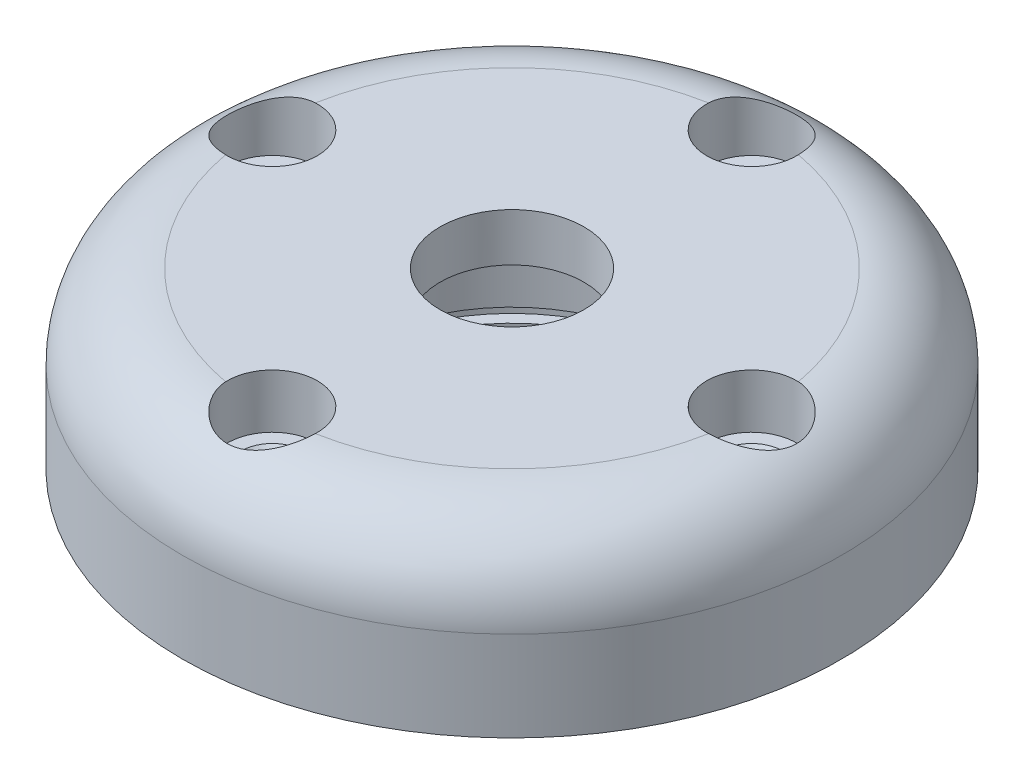
ISO-10303-21;
HEADER;
FILE_DESCRIPTION(('STEP AP214'),'2;1');
FILE_NAME('part.step','',(''),(''),'','','');
FILE_SCHEMA(('AUTOMOTIVE_DESIGN { 1 0 10303 214 1 1 1 1 }'));
ENDSEC;
DATA;
#1=APPLICATION_CONTEXT('core data for automotive mechanical design processes');
#2=APPLICATION_PROTOCOL_DEFINITION('international standard','automotive_design',2000,#1);
#3=PRODUCT_CONTEXT('',#1,'mechanical');
#4=PRODUCT('Part','Part','',(#3));
#5=PRODUCT_RELATED_PRODUCT_CATEGORY('part','',(#4));
#6=PRODUCT_DEFINITION_FORMATION('','',#4);
#7=PRODUCT_DEFINITION_CONTEXT('part definition',#1,'design');
#8=PRODUCT_DEFINITION('design','',#6,#7);
#9=PRODUCT_DEFINITION_SHAPE('','',#8);
#10=(LENGTH_UNIT() NAMED_UNIT(*) SI_UNIT(.MILLI.,.METRE.));
#11=(NAMED_UNIT(*) PLANE_ANGLE_UNIT() SI_UNIT($,.RADIAN.));
#12=(NAMED_UNIT(*) SI_UNIT($,.STERADIAN.) SOLID_ANGLE_UNIT());
#13=UNCERTAINTY_MEASURE_WITH_UNIT(LENGTH_MEASURE(1.E-05),#10,'distance_accuracy_value','');
#14=(GEOMETRIC_REPRESENTATION_CONTEXT(3) GLOBAL_UNCERTAINTY_ASSIGNED_CONTEXT((#13)) GLOBAL_UNIT_ASSIGNED_CONTEXT((#10,
#11,#12)) REPRESENTATION_CONTEXT('',''));
#15=CARTESIAN_POINT('',(0.,0.,0.));
#16=DIRECTION('',(0.,0.,1.));
#17=DIRECTION('',(1.,0.,0.));
#18=AXIS2_PLACEMENT_3D('',#15,#16,#17);
#19=CARTESIAN_POINT('',(0.,7.84,0.));
#20=DIRECTION('',(0.,-1.,0.));
#21=DIRECTION('',(0.,0.,-1.));
#22=AXIS2_PLACEMENT_3D('',#19,#20,#21);
#23=CYLINDRICAL_SURFACE('',#22,13.);
#24=CARTESIAN_POINT('',(0.,7.84,0.));
#25=DIRECTION('',(0.,1.,0.));
#26=DIRECTION('',(0.,0.,1.));
#27=AXIS2_PLACEMENT_3D('',#24,#25,#26);
#28=CIRCLE('',#27,13.);
#29=CARTESIAN_POINT('',(0.,7.84,-13.));
#30=VERTEX_POINT('',#29);
#31=EDGE_CURVE('E225',#30,#30,#28,.T.);
#32=CARTESIAN_POINT('',(0.,6.5,0.));
#33=DIRECTION('',(0.,-1.,0.));
#34=DIRECTION('',(0.,0.,-1.));
#35=AXIS2_PLACEMENT_3D('',#32,#33,#34);
#36=CIRCLE('',#35,13.);
#37=CARTESIAN_POINT('',(0.,6.5,-13.));
#38=VERTEX_POINT('',#37);
#39=EDGE_CURVE('E228',#38,#38,#36,.T.);
#40=CARTESIAN_POINT('',(0.,7.84,-13.));
#41=CARTESIAN_POINT('',(0.,7.82604166666667,-13.));
#42=CARTESIAN_POINT('',(0.,7.81208333333333,-13.));
#43=CARTESIAN_POINT('',(0.,7.78416666666667,-13.));
#44=CARTESIAN_POINT('',(0.,7.77020833333333,-13.));
#45=CARTESIAN_POINT('',(0.,7.74229166666667,-13.));
#46=CARTESIAN_POINT('',(0.,7.72833333333333,-13.));
#47=CARTESIAN_POINT('',(0.,7.70041666666667,-13.));
#48=CARTESIAN_POINT('',(0.,7.68645833333333,-13.));
#49=CARTESIAN_POINT('',(0.,7.65854166666667,-13.));
#50=CARTESIAN_POINT('',(0.,7.64458333333333,-13.));
#51=CARTESIAN_POINT('',(0.,7.61666666666667,-13.));
#52=CARTESIAN_POINT('',(0.,7.60270833333333,-13.));
#53=CARTESIAN_POINT('',(0.,7.57479166666667,-13.));
#54=CARTESIAN_POINT('',(0.,7.56083333333333,-13.));
#55=CARTESIAN_POINT('',(0.,7.53291666666667,-13.));
#56=CARTESIAN_POINT('',(0.,7.51895833333333,-13.));
#57=CARTESIAN_POINT('',(0.,7.49104166666667,-13.));
#58=CARTESIAN_POINT('',(0.,7.47708333333333,-13.));
#59=CARTESIAN_POINT('',(0.,7.44916666666667,-13.));
#60=CARTESIAN_POINT('',(0.,7.43520833333333,-13.));
#61=CARTESIAN_POINT('',(0.,7.40729166666667,-13.));
#62=CARTESIAN_POINT('',(0.,7.39333333333333,-13.));
#63=CARTESIAN_POINT('',(0.,7.36541666666667,-13.));
#64=CARTESIAN_POINT('',(0.,7.35145833333333,-13.));
#65=CARTESIAN_POINT('',(0.,7.32354166666667,-13.));
#66=CARTESIAN_POINT('',(0.,7.30958333333333,-13.));
#67=CARTESIAN_POINT('',(0.,7.28166666666667,-13.));
#68=CARTESIAN_POINT('',(0.,7.26770833333333,-13.));
#69=CARTESIAN_POINT('',(0.,7.23979166666667,-13.));
#70=CARTESIAN_POINT('',(0.,7.22583333333333,-13.));
#71=CARTESIAN_POINT('',(0.,7.19791666666667,-13.));
#72=CARTESIAN_POINT('',(0.,7.18395833333333,-13.));
#73=CARTESIAN_POINT('',(0.,7.15604166666667,-13.));
#74=CARTESIAN_POINT('',(0.,7.14208333333333,-13.));
#75=CARTESIAN_POINT('',(0.,7.11416666666667,-13.));
#76=CARTESIAN_POINT('',(0.,7.10020833333333,-13.));
#77=CARTESIAN_POINT('',(0.,7.07229166666667,-13.));
#78=CARTESIAN_POINT('',(0.,7.05833333333333,-13.));
#79=CARTESIAN_POINT('',(0.,7.03041666666667,-13.));
#80=CARTESIAN_POINT('',(0.,7.01645833333333,-13.));
#81=CARTESIAN_POINT('',(0.,6.98854166666667,-13.));
#82=CARTESIAN_POINT('',(0.,6.97458333333333,-13.));
#83=CARTESIAN_POINT('',(0.,6.94666666666667,-13.));
#84=CARTESIAN_POINT('',(0.,6.93270833333333,-13.));
#85=CARTESIAN_POINT('',(0.,6.90479166666667,-13.));
#86=CARTESIAN_POINT('',(0.,6.89083333333333,-13.));
#87=CARTESIAN_POINT('',(0.,6.86291666666667,-13.));
#88=CARTESIAN_POINT('',(0.,6.84895833333333,-13.));
#89=CARTESIAN_POINT('',(0.,6.82104166666667,-13.));
#90=CARTESIAN_POINT('',(0.,6.80708333333333,-13.));
#91=CARTESIAN_POINT('',(0.,6.77916666666667,-13.));
#92=CARTESIAN_POINT('',(0.,6.76520833333333,-13.));
#93=CARTESIAN_POINT('',(0.,6.73729166666667,-13.));
#94=CARTESIAN_POINT('',(0.,6.72333333333333,-13.));
#95=CARTESIAN_POINT('',(0.,6.69541666666667,-13.));
#96=CARTESIAN_POINT('',(0.,6.68145833333333,-13.));
#97=CARTESIAN_POINT('',(0.,6.65354166666667,-13.));
#98=CARTESIAN_POINT('',(0.,6.63958333333333,-13.));
#99=CARTESIAN_POINT('',(0.,6.61166666666667,-13.));
#100=CARTESIAN_POINT('',(0.,6.59770833333334,-13.));
#101=CARTESIAN_POINT('',(0.,6.56979166666667,-13.));
#102=CARTESIAN_POINT('',(0.,6.55583333333333,-13.));
#103=CARTESIAN_POINT('',(0.,6.52791666666667,-13.));
#104=CARTESIAN_POINT('',(0.,6.51395833333333,-13.));
#105=CARTESIAN_POINT('',(0.,6.5,-13.));
#106=B_SPLINE_CURVE_WITH_KNOTS('',3,(#40,#41,#42,#43,#44,#45,#46,#47,#48,#49,#50,#51,#52,#53,
#54,#55,#56,#57,#58,#59,#60,#61,#62,#63,#64,#65,#66,#67,#68,#69,#70,#71,#72,#73,#74,#75,#76,#77,
#78,#79,#80,#81,#82,#83,#84,#85,#86,#87,#88,#89,#90,#91,#92,#93,#94,#95,#96,#97,#98,#99,#100,
#101,#102,#103,#104,#105),.UNSPECIFIED.,.F.,.F.,(4,2,2,2,2,2,2,2,2,2,2,2,2,2,2,2,2,2,2,2,2,2,2,
2,2,2,2,2,2,2,2,2,4),(0.,0.0418750000000011,0.0837500000000005,0.125625000000001,
0.167500000000001,0.209375,0.251250000000001,0.293125,0.335,0.376875,0.41875,0.460625,0.5025,
0.544375,0.58625,0.628125,0.67,0.711875,0.753749999999999,0.795624999999999,0.8375,
0.879374999999999,0.921249999999999,0.963125,1.005,1.046875,1.08875,1.130625,1.1725,1.214375,
1.25625,1.298125,1.34),.UNSPECIFIED.);
#107=EDGE_CURVE('BSEAM47',#30,#38,#106,.T.);
#108=ORIENTED_EDGE('',*,*,#31,.T.);
#109=ORIENTED_EDGE('',*,*,#39,.T.);
#110=ORIENTED_EDGE('',*,*,#107,.T.);
#111=ORIENTED_EDGE('',*,*,#107,.F.);
#112=EDGE_LOOP('',(#108,#110,#109,#111));
#113=FACE_BOUND('',#112,.T.);
#114=ADVANCED_FACE('F47',(#113),#23,.F.);
#115=CARTESIAN_POINT('',(0.,21.,0.));
#116=DIRECTION('',(0.,-1.,0.));
#117=DIRECTION('',(0.,0.,-1.));
#118=AXIS2_PLACEMENT_3D('',#115,#116,#117);
#119=CYLINDRICAL_SURFACE('',#118,14.);
#120=CARTESIAN_POINT('',(0.,7.84,0.));
#121=DIRECTION('',(0.,1.,0.));
#122=DIRECTION('',(0.,0.,1.));
#123=AXIS2_PLACEMENT_3D('',#120,#121,#122);
#124=CIRCLE('',#123,14.);
#125=CARTESIAN_POINT('',(0.,7.84,14.));
#126=VERTEX_POINT('',#125);
#127=EDGE_CURVE('E114',#126,#126,#124,.T.);
#128=ORIENTED_EDGE('',*,*,#127,.F.);
#129=EDGE_LOOP('',(#128));
#130=FACE_BOUND('',#129,.T.);
#131=CARTESIAN_POINT('',(0.,9.,0.));
#132=DIRECTION('',(0.,1.,0.));
#133=DIRECTION('',(0.,0.,1.));
#134=AXIS2_PLACEMENT_3D('',#131,#132,#133);
#135=CIRCLE('',#134,14.);
#136=CARTESIAN_POINT('',(0.,9.,14.));
#137=VERTEX_POINT('',#136);
#138=EDGE_CURVE('E241',#137,#137,#135,.T.);
#139=ORIENTED_EDGE('',*,*,#138,.T.);
#140=EDGE_LOOP('',(#139));
#141=FACE_BOUND('',#140,.T.);
#142=ADVANCED_FACE('F196',(#130,#141),#119,.F.);
#143=CARTESIAN_POINT('',(0.,57.5979797464467,0.));
#144=DIRECTION('',(0.,-1.,0.));
#145=DIRECTION('',(0.,0.,-1.));
#146=AXIS2_PLACEMENT_3D('',#143,#144,#145);
#147=CYLINDRICAL_SURFACE('',#146,13.);
#148=CARTESIAN_POINT('',(0.,17.,0.));
#149=DIRECTION('',(0.,-1.,0.));
#150=DIRECTION('',(0.,0.,-1.));
#151=AXIS2_PLACEMENT_3D('',#148,#149,#150);
#152=CIRCLE('',#151,13.);
#153=CARTESIAN_POINT('',(0.,17.,-13.));
#154=VERTEX_POINT('',#153);
#155=EDGE_CURVE('E107',#154,#154,#152,.T.);
#156=ORIENTED_EDGE('',*,*,#155,.F.);
#157=EDGE_LOOP('',(#156));
#158=FACE_BOUND('',#157,.T.);
#159=CARTESIAN_POINT('',(0.,9.,0.));
#160=DIRECTION('',(0.,1.,0.));
#161=DIRECTION('',(0.,0.,1.));
#162=AXIS2_PLACEMENT_3D('',#159,#160,#161);
#163=CIRCLE('',#162,13.);
#164=CARTESIAN_POINT('',(0.,9.,13.));
#165=VERTEX_POINT('',#164);
#166=EDGE_CURVE('E264',#165,#165,#163,.T.);
#167=ORIENTED_EDGE('',*,*,#166,.F.);
#168=EDGE_LOOP('',(#167));
#169=FACE_BOUND('',#168,.T.);
#170=ADVANCED_FACE('F202',(#158,#169),#147,.F.);
#171=CARTESIAN_POINT('',(0.,9.,0.));
#172=DIRECTION('',(0.,1.,0.));
#173=DIRECTION('',(0.,0.,1.));
#174=AXIS2_PLACEMENT_3D('',#171,#172,#173);
#175=PLANE('',#174);
#176=ORIENTED_EDGE('',*,*,#166,.T.);
#177=EDGE_LOOP('',(#176));
#178=FACE_BOUND('',#177,.T.);
#179=ORIENTED_EDGE('',*,*,#138,.F.);
#180=EDGE_LOOP('',(#179));
#181=FACE_BOUND('',#180,.T.);
#182=ADVANCED_FACE('F212',(#178,#181),#175,.F.);
#183=CARTESIAN_POINT('',(0.,7.84,0.));
#184=DIRECTION('',(0.,1.,0.));
#185=DIRECTION('',(0.,0.,1.));
#186=AXIS2_PLACEMENT_3D('',#183,#184,#185);
#187=PLANE('',#186);
#188=ORIENTED_EDGE('',*,*,#127,.T.);
#189=EDGE_LOOP('',(#188));
#190=FACE_BOUND('',#189,.T.);
#191=ORIENTED_EDGE('',*,*,#31,.F.);
#192=EDGE_LOOP('',(#191));
#193=FACE_BOUND('',#192,.T.);
#194=ADVANCED_FACE('F210',(#190,#193),#187,.T.);
#195=CARTESIAN_POINT('',(0.,17.,0.));
#196=DIRECTION('',(0.,-1.,0.));
#197=DIRECTION('',(0.,0.,-1.));
#198=AXIS2_PLACEMENT_3D('',#195,#196,#197);
#199=PLANE('',#198);
#200=CARTESIAN_POINT('',(0.,17.,0.));
#201=DIRECTION('',(0.,-1.,0.));
#202=DIRECTION('',(0.,0.,-1.));
#203=AXIS2_PLACEMENT_3D('',#200,#201,#202);
#204=CIRCLE('',#203,6.);
#205=CARTESIAN_POINT('',(0.,17.,-6.));
#206=VERTEX_POINT('',#205);
#207=EDGE_CURVE('E334',#206,#206,#204,.T.);
#208=ORIENTED_EDGE('',*,*,#207,.F.);
#209=EDGE_LOOP('',(#208));
#210=FACE_BOUND('',#209,.T.);
#211=ORIENTED_EDGE('',*,*,#155,.T.);
#212=EDGE_LOOP('',(#211));
#213=FACE_BOUND('',#212,.T.);
#214=ADVANCED_FACE('F208',(#210,#213),#199,.T.);
#215=CARTESIAN_POINT('',(0.,6.5,0.));
#216=DIRECTION('',(0.,-1.,0.));
#217=DIRECTION('',(0.,0.,-1.));
#218=AXIS2_PLACEMENT_3D('',#215,#216,#217);
#219=PLANE('',#218);
#220=ORIENTED_EDGE('',*,*,#39,.F.);
#221=EDGE_LOOP('',(#220));
#222=FACE_BOUND('',#221,.T.);
#223=CARTESIAN_POINT('',(0.,6.5,-20.));
#224=DIRECTION('',(0.,-1.,0.));
#225=DIRECTION('',(0.,0.,-1.));
#226=AXIS2_PLACEMENT_3D('',#223,#224,#225);
#227=CIRCLE('',#226,2.1);
#228=CARTESIAN_POINT('',(0.,6.5,-22.1));
#229=VERTEX_POINT('',#228);
#230=EDGE_CURVE('E315',#229,#229,#227,.F.);
#231=ORIENTED_EDGE('',*,*,#230,.T.);
#232=EDGE_LOOP('',(#231));
#233=FACE_BOUND('',#232,.T.);
#234=CARTESIAN_POINT('',(20.,6.5,0.));
#235=DIRECTION('',(0.,-1.,0.));
#236=DIRECTION('',(0.,0.,-1.));
#237=AXIS2_PLACEMENT_3D('',#234,#235,#236);
#238=CIRCLE('',#237,2.1);
#239=CARTESIAN_POINT('',(20.,6.5,-2.1));
#240=VERTEX_POINT('',#239);
#241=EDGE_CURVE('E318',#240,#240,#238,.F.);
#242=ORIENTED_EDGE('',*,*,#241,.T.);
#243=EDGE_LOOP('',(#242));
#244=FACE_BOUND('',#243,.T.);
#245=CARTESIAN_POINT('',(-20.,6.5,0.));
#246=DIRECTION('',(0.,-1.,0.));
#247=DIRECTION('',(0.,0.,-1.));
#248=AXIS2_PLACEMENT_3D('',#245,#246,#247);
#249=CIRCLE('',#248,2.1);
#250=CARTESIAN_POINT('',(-20.,6.5,-2.1));
#251=VERTEX_POINT('',#250);
#252=EDGE_CURVE('E324',#251,#251,#249,.F.);
#253=ORIENTED_EDGE('',*,*,#252,.T.);
#254=EDGE_LOOP('',(#253));
#255=FACE_BOUND('',#254,.T.);
#256=CARTESIAN_POINT('',(0.,6.5,20.));
#257=DIRECTION('',(0.,-1.,0.));
#258=DIRECTION('',(0.,0.,-1.));
#259=AXIS2_PLACEMENT_3D('',#256,#257,#258);
#260=CIRCLE('',#259,2.1);
#261=CARTESIAN_POINT('',(0.,6.5,17.9));
#262=VERTEX_POINT('',#261);
#263=EDGE_CURVE('E117',#262,#262,#260,.F.);
#264=ORIENTED_EDGE('',*,*,#263,.T.);
#265=EDGE_LOOP('',(#264));
#266=FACE_BOUND('',#265,.T.);
#267=CARTESIAN_POINT('',(0.,6.5,0.));
#268=DIRECTION('',(0.,-1.,0.));
#269=DIRECTION('',(0.,0.,-1.));
#270=AXIS2_PLACEMENT_3D('',#267,#268,#269);
#271=CIRCLE('',#270,27.5);
#272=CARTESIAN_POINT('',(0.,6.5,-27.5));
#273=VERTEX_POINT('',#272);
#274=EDGE_CURVE('E235',#273,#273,#271,.T.);
#275=ORIENTED_EDGE('',*,*,#274,.T.);
#276=EDGE_LOOP('',(#275));
#277=FACE_BOUND('',#276,.T.);
#278=ADVANCED_FACE('F151',(#222,#233,#244,#255,#266,#277),#219,.T.);
#279=CARTESIAN_POINT('',(20.,16.5,0.));
#280=DIRECTION('',(0.,1.,0.));
#281=DIRECTION('',(0.,0.,1.));
#282=AXIS2_PLACEMENT_3D('',#279,#280,#281);
#283=PLANE('',#282);
#284=CARTESIAN_POINT('',(20.,16.5,0.));
#285=DIRECTION('',(0.,1.,0.));
#286=DIRECTION('',(0.,0.,1.));
#287=AXIS2_PLACEMENT_3D('',#284,#285,#286);
#288=CIRCLE('',#287,2.60000000000003);
#289=CARTESIAN_POINT('',(20.,16.5,2.60000000000003));
#290=VERTEX_POINT('',#289);
#291=EDGE_CURVE('E272',#290,#290,#288,.F.);
#292=ORIENTED_EDGE('',*,*,#291,.T.);
#293=EDGE_LOOP('',(#292));
#294=FACE_BOUND('',#293,.T.);
#295=CARTESIAN_POINT('',(20.,16.5,0.));
#296=DIRECTION('',(0.,1.,0.));
#297=DIRECTION('',(0.,0.,1.));
#298=AXIS2_PLACEMENT_3D('',#295,#296,#297);
#299=CIRCLE('',#298,3.75);
#300=CARTESIAN_POINT('',(20.,16.5,3.75));
#301=VERTEX_POINT('',#300);
#302=EDGE_CURVE('E232',#301,#301,#299,.T.);
#303=ORIENTED_EDGE('',*,*,#302,.T.);
#304=EDGE_LOOP('',(#303));
#305=FACE_BOUND('',#304,.T.);
#306=ADVANCED_FACE('F147',(#294,#305),#283,.T.);
#307=CARTESIAN_POINT('',(20.,16.,0.));
#308=DIRECTION('',(0.,1.,0.));
#309=DIRECTION('',(0.,0.,1.));
#310=AXIS2_PLACEMENT_3D('',#307,#308,#309);
#311=CONICAL_SURFACE('',#310,2.1,0.785398163397456);
#312=ORIENTED_EDGE('',*,*,#291,.F.);
#313=EDGE_LOOP('',(#312));
#314=FACE_BOUND('',#313,.T.);
#315=CARTESIAN_POINT('',(20.,16.,0.));
#316=DIRECTION('',(0.,1.,0.));
#317=DIRECTION('',(0.,0.,1.));
#318=AXIS2_PLACEMENT_3D('',#315,#316,#317);
#319=CIRCLE('',#318,2.1);
#320=CARTESIAN_POINT('',(20.,16.,2.1));
#321=VERTEX_POINT('',#320);
#322=EDGE_CURVE('E268',#321,#321,#319,.T.);
#323=ORIENTED_EDGE('',*,*,#322,.F.);
#324=EDGE_LOOP('',(#323));
#325=FACE_BOUND('',#324,.T.);
#326=ADVANCED_FACE('F150',(#314,#325),#311,.F.);
#327=CARTESIAN_POINT('',(20.,2.999,0.));
#328=DIRECTION('',(0.,1.,0.));
#329=DIRECTION('',(0.,0.,1.));
#330=AXIS2_PLACEMENT_3D('',#327,#328,#329);
#331=CYLINDRICAL_SURFACE('',#330,2.1);
#332=ORIENTED_EDGE('',*,*,#322,.T.);
#333=EDGE_LOOP('',(#332));
#334=FACE_BOUND('',#333,.T.);
#335=ORIENTED_EDGE('',*,*,#241,.F.);
#336=EDGE_LOOP('',(#335));
#337=FACE_BOUND('',#336,.T.);
#338=ADVANCED_FACE('F157',(#334,#337),#331,.F.);
#339=CARTESIAN_POINT('',(20.,16.5,0.));
#340=DIRECTION('',(0.,1.,0.));
#341=DIRECTION('',(0.,0.,1.));
#342=AXIS2_PLACEMENT_3D('',#339,#340,#341);
#343=CYLINDRICAL_SURFACE('',#342,3.75);
#344=ORIENTED_EDGE('',*,*,#302,.F.);
#345=EDGE_LOOP('',(#344));
#346=FACE_BOUND('',#345,.T.);
#347=CARTESIAN_POINT('',(20.,21.,0.));
#348=DIRECTION('',(0.,1.,0.));
#349=DIRECTION('',(0.,0.,1.));
#350=AXIS2_PLACEMENT_3D('',#347,#348,#349);
#351=CIRCLE('',#350,3.75);
#352=CARTESIAN_POINT('',(20.1546875,21.,-3.74680821197773));
#353=VERTEX_POINT('',#352);
#354=CARTESIAN_POINT('',(20.1546875,21.,3.74680821197773));
#355=VERTEX_POINT('',#354);
#356=EDGE_CURVE('E227',#353,#355,#351,.T.);
#357=ORIENTED_EDGE('',*,*,#356,.T.);
#358=CARTESIAN_POINT('',(20.1546875,21.,3.74680821197773));
#359=CARTESIAN_POINT('',(20.2550579093395,21.0000136267651,3.7426800229597));
#360=CARTESIAN_POINT('',(20.3552407486366,20.9979454418549,3.73448888748793));
#361=CARTESIAN_POINT('',(20.5544286972791,20.9899716316907,3.71014015190503));
#362=CARTESIAN_POINT('',(20.6534343952188,20.9840680141428,3.69398672082587));
#363=CARTESIAN_POINT('',(20.8491622413412,20.9687808637851,3.65395200218214));
#364=CARTESIAN_POINT('',(20.9458922029237,20.9594119753941,3.63010328865331));
#365=CARTESIAN_POINT('',(21.1368169438424,20.9375958983529,3.57491736451108));
#366=CARTESIAN_POINT('',(21.2310114563219,20.9251483870707,3.54357936905154));
#367=CARTESIAN_POINT('',(21.5085524418926,20.8838737618643,3.4388581781488));
#368=CARTESIAN_POINT('',(21.6873619587163,20.8510712864023,3.35466297601473));
#369=CARTESIAN_POINT('',(22.0286043656087,20.7786080025552,3.16005839165242));
#370=CARTESIAN_POINT('',(22.1910197341546,20.7389399768387,3.04962137699367));
#371=CARTESIAN_POINT('',(22.5055174738715,20.6541472531192,2.79782889586576));
#372=CARTESIAN_POINT('',(22.6563782143603,20.6088375776394,2.65500591807258));
#373=CARTESIAN_POINT('',(22.9327146251184,20.5195739919008,2.34619806132488));
#374=CARTESIAN_POINT('',(23.058184045777,20.4756204176724,2.18020749703706));
#375=CARTESIAN_POINT('',(23.2848304620249,20.3921433532247,1.82182064403521));
#376=CARTESIAN_POINT('',(23.384880604033,20.3528568648743,1.62865152597486));
#377=CARTESIAN_POINT('',(23.5505142495519,20.2857284074601,1.22622120285516));
#378=CARTESIAN_POINT('',(23.6161178291447,20.2578797742725,1.01696945275705));
#379=CARTESIAN_POINT('',(23.7072398632603,20.2186827913765,0.601237684606776));
#380=CARTESIAN_POINT('',(23.7348655874994,20.2064698728309,0.395302832610523));
#381=CARTESIAN_POINT('',(23.7556683540207,20.1973026805983,-0.0186049418704133));
#382=CARTESIAN_POINT('',(23.7488586470122,20.2003425376595,-0.226577049679763));
#383=CARTESIAN_POINT('',(23.7026983546555,20.2205629481887,-0.624579162565959));
#384=CARTESIAN_POINT('',(23.6654540682441,20.2368278765241,-0.814906698623091));
#385=CARTESIAN_POINT('',(23.5626041335922,20.2804226679893,-1.18638654224633));
#386=CARTESIAN_POINT('',(23.496993348358,20.3077545352147,-1.36753718129313));
#387=CARTESIAN_POINT('',(23.3371528715142,20.3715481498316,-1.72187722371259));
#388=CARTESIAN_POINT('',(23.2421032037732,20.4082653981155,-1.89464898683827));
#389=CARTESIAN_POINT('',(23.026810998033,20.4866425055942,-2.22247558557422));
#390=CARTESIAN_POINT('',(22.9065596751191,20.5283040861062,-2.37752421396549));
#391=CARTESIAN_POINT('',(22.6332943196957,20.6159443946116,-2.67819068291094));
#392=CARTESIAN_POINT('',(22.4784555417994,20.6620062563349,-2.82212753244855));
#393=CARTESIAN_POINT('',(22.1459206038153,20.7504194440059,-3.08254393958806));
#394=CARTESIAN_POINT('',(21.9682109127703,20.7927685482639,-3.19900712665269));
#395=CARTESIAN_POINT('',(21.6864928414327,20.8500594141915,-3.35110584304495));
#396=CARTESIAN_POINT('',(21.589230289625,20.868235839239,-3.39832045468057));
#397=CARTESIAN_POINT('',(21.3905896958449,20.9017383218859,-3.48431515036229));
#398=CARTESIAN_POINT('',(21.2892136023381,20.9170657102262,-3.52309917364672));
#399=CARTESIAN_POINT('',(21.0832636098872,20.9442534876856,-3.59176919466027));
#400=CARTESIAN_POINT('',(20.978696226222,20.9561204786313,-3.62167213796575));
#401=CARTESIAN_POINT('',(20.7670501894197,20.975879872543,-3.67232330128085));
#402=CARTESIAN_POINT('',(20.6599732715881,20.9837749418367,-3.6930776615189));
#403=CARTESIAN_POINT('',(20.4862809897874,20.992917244,-3.71893308694843));
#404=CARTESIAN_POINT('',(20.4201623557858,20.9955561826808,-3.72698231812564));
#405=CARTESIAN_POINT('',(20.2876198637921,20.9990976404173,-3.739545946679));
#406=CARTESIAN_POINT('',(20.2211964361159,21.0000021220086,-3.7440643357625));
#407=CARTESIAN_POINT('',(20.1546875,21.,-3.74680821197774));
#408=B_SPLINE_CURVE_WITH_KNOTS('',3,(#358,#359,#360,#361,#362,#363,#364,#365,#366,#367,#368,
#369,#370,#371,#372,#373,#374,#375,#376,#377,#378,#379,#380,#381,#382,#383,#384,#385,#386,#387,
#388,#389,#390,#391,#392,#393,#394,#395,#396,#397,#398,#399,#400,#401,#402,#403,#404,#405,#406,
#407),.UNSPECIFIED.,.F.,.F.,(4,2,2,2,2,2,2,2,2,2,2,2,2,2,2,2,2,2,2,2,2,2,2,2,4),(0.,
0.301231811536334,0.602306066352935,0.902122238333132,1.20196984361201,1.80012992265894,
2.39892267295355,3.03398237897557,3.6691982037676,4.32897488035361,4.98836659909254,
5.6094522079617,6.23029884208332,6.81148951768866,7.392785487365,7.99200322743612,
8.5914301941866,9.23764942878334,9.884252754304,10.2127927387325,10.5411788794986,
10.8689343559507,11.1964695175029,11.3963395129604,11.5959832220526),.UNSPECIFIED.);
#409=EDGE_CURVE('E57',#355,#353,#408,.T.);
#410=ORIENTED_EDGE('',*,*,#409,.T.);
#411=EDGE_LOOP('',(#357,#410));
#412=FACE_BOUND('',#411,.T.);
#413=ADVANCED_FACE('F153',(#346,#412),#343,.F.);
#414=CARTESIAN_POINT('',(0.,16.5,-20.));
#415=DIRECTION('',(0.,1.,0.));
#416=DIRECTION('',(0.,0.,1.));
#417=AXIS2_PLACEMENT_3D('',#414,#415,#416);
#418=PLANE('',#417);
#419=CARTESIAN_POINT('',(0.,16.5,-20.));
#420=DIRECTION('',(0.,1.,0.));
#421=DIRECTION('',(0.,0.,1.));
#422=AXIS2_PLACEMENT_3D('',#419,#420,#421);
#423=CIRCLE('',#422,2.60000000000003);
#424=CARTESIAN_POINT('',(0.,16.5,-17.4));
#425=VERTEX_POINT('',#424);
#426=EDGE_CURVE('E296',#425,#425,#423,.F.);
#427=ORIENTED_EDGE('',*,*,#426,.T.);
#428=EDGE_LOOP('',(#427));
#429=FACE_BOUND('',#428,.T.);
#430=CARTESIAN_POINT('',(0.,16.5,-20.));
#431=DIRECTION('',(0.,1.,0.));
#432=DIRECTION('',(0.,0.,1.));
#433=AXIS2_PLACEMENT_3D('',#430,#431,#432);
#434=CIRCLE('',#433,3.75);
#435=CARTESIAN_POINT('',(0.,16.5,-16.25));
#436=VERTEX_POINT('',#435);
#437=EDGE_CURVE('E250',#436,#436,#434,.T.);
#438=ORIENTED_EDGE('',*,*,#437,.T.);
#439=EDGE_LOOP('',(#438));
#440=FACE_BOUND('',#439,.T.);
#441=ADVANCED_FACE('F146',(#429,#440),#418,.T.);
#442=CARTESIAN_POINT('',(0.,16.,-20.));
#443=DIRECTION('',(0.,1.,0.));
#444=DIRECTION('',(0.,0.,1.));
#445=AXIS2_PLACEMENT_3D('',#442,#443,#444);
#446=CONICAL_SURFACE('',#445,2.1,0.785398163397456);
#447=ORIENTED_EDGE('',*,*,#426,.F.);
#448=EDGE_LOOP('',(#447));
#449=FACE_BOUND('',#448,.T.);
#450=CARTESIAN_POINT('',(0.,16.,-20.));
#451=DIRECTION('',(0.,1.,0.));
#452=DIRECTION('',(0.,0.,1.));
#453=AXIS2_PLACEMENT_3D('',#450,#451,#452);
#454=CIRCLE('',#453,2.1);
#455=CARTESIAN_POINT('',(0.,16.,-17.9));
#456=VERTEX_POINT('',#455);
#457=EDGE_CURVE('E292',#456,#456,#454,.T.);
#458=ORIENTED_EDGE('',*,*,#457,.F.);
#459=EDGE_LOOP('',(#458));
#460=FACE_BOUND('',#459,.T.);
#461=ADVANCED_FACE('F305',(#449,#460),#446,.F.);
#462=CARTESIAN_POINT('',(0.,2.999,-20.));
#463=DIRECTION('',(0.,1.,0.));
#464=DIRECTION('',(0.,0.,1.));
#465=AXIS2_PLACEMENT_3D('',#462,#463,#464);
#466=CYLINDRICAL_SURFACE('',#465,2.1);
#467=ORIENTED_EDGE('',*,*,#457,.T.);
#468=EDGE_LOOP('',(#467));
#469=FACE_BOUND('',#468,.T.);
#470=ORIENTED_EDGE('',*,*,#230,.F.);
#471=EDGE_LOOP('',(#470));
#472=FACE_BOUND('',#471,.T.);
#473=ADVANCED_FACE('F144',(#469,#472),#466,.F.);
#474=CARTESIAN_POINT('',(0.,16.5,-20.));
#475=DIRECTION('',(0.,1.,0.));
#476=DIRECTION('',(0.,0.,1.));
#477=AXIS2_PLACEMENT_3D('',#474,#475,#476);
#478=CYLINDRICAL_SURFACE('',#477,3.75);
#479=ORIENTED_EDGE('',*,*,#437,.F.);
#480=EDGE_LOOP('',(#479));
#481=FACE_BOUND('',#480,.T.);
#482=CARTESIAN_POINT('',(0.,21.,-20.));
#483=DIRECTION('',(0.,1.,0.));
#484=DIRECTION('',(0.,0.,1.));
#485=AXIS2_PLACEMENT_3D('',#482,#483,#484);
#486=CIRCLE('',#485,3.75);
#487=CARTESIAN_POINT('',(-3.74680821197773,21.,-20.1546875));
#488=VERTEX_POINT('',#487);
#489=CARTESIAN_POINT('',(3.74680821197773,21.,-20.1546875));
#490=VERTEX_POINT('',#489);
#491=EDGE_CURVE('E254',#488,#490,#486,.T.);
#492=ORIENTED_EDGE('',*,*,#491,.T.);
#493=CARTESIAN_POINT('',(3.74680821197773,21.,-20.1546875));
#494=CARTESIAN_POINT('',(3.7426800229597,21.0000136267651,-20.2550579093395));
#495=CARTESIAN_POINT('',(3.73448888748793,20.9979454418549,-20.3552407486366));
#496=CARTESIAN_POINT('',(3.71014015190503,20.9899716316907,-20.5544286972791));
#497=CARTESIAN_POINT('',(3.69398672082588,20.9840680141428,-20.6534343952188));
#498=CARTESIAN_POINT('',(3.65395200218214,20.9687808637851,-20.8491622413412));
#499=CARTESIAN_POINT('',(3.63010328865331,20.9594119753941,-20.9458922029237));
#500=CARTESIAN_POINT('',(3.57491736451109,20.9375958983529,-21.1368169438424));
#501=CARTESIAN_POINT('',(3.54357936905154,20.9251483870707,-21.2310114563219));
#502=CARTESIAN_POINT('',(3.4388581781488,20.8838737618643,-21.5085524418926));
#503=CARTESIAN_POINT('',(3.35466297601473,20.8510712864023,-21.6873619587163));
#504=CARTESIAN_POINT('',(3.16005839165242,20.7786080025552,-22.0286043656087));
#505=CARTESIAN_POINT('',(3.04962137699367,20.7389399768387,-22.1910197341546));
#506=CARTESIAN_POINT('',(2.79782889586576,20.6541472531192,-22.5055174738715));
#507=CARTESIAN_POINT('',(2.65500591807259,20.6088375776394,-22.6563782143603));
#508=CARTESIAN_POINT('',(2.34619806132488,20.5195739919008,-22.9327146251184));
#509=CARTESIAN_POINT('',(2.18020749703706,20.4756204176724,-23.058184045777));
#510=CARTESIAN_POINT('',(1.82182064403521,20.3921433532247,-23.2848304620249));
#511=CARTESIAN_POINT('',(1.62865152597487,20.3528568648743,-23.3848806040329));
#512=CARTESIAN_POINT('',(1.22622120285516,20.28572840746,-23.5505142495519));
#513=CARTESIAN_POINT('',(1.01696945275705,20.2578797742725,-23.6161178291447));
#514=CARTESIAN_POINT('',(0.601237684606775,20.2186827913765,-23.7072398632603));
#515=CARTESIAN_POINT('',(0.395302832610522,20.2064698728309,-23.7348655874994));
#516=CARTESIAN_POINT('',(-0.0186049418704146,20.1973026805983,-23.7556683540207));
#517=CARTESIAN_POINT('',(-0.226577049679765,20.2003425376595,-23.7488586470122));
#518=CARTESIAN_POINT('',(-0.62457916256596,20.2205629481887,-23.7026983546554));
#519=CARTESIAN_POINT('',(-0.814906698623091,20.2368278765241,-23.6654540682441));
#520=CARTESIAN_POINT('',(-1.18638654224633,20.2804226679893,-23.5626041335922));
#521=CARTESIAN_POINT('',(-1.36753718129313,20.3077545352147,-23.496993348358));
#522=CARTESIAN_POINT('',(-1.72187722371259,20.3715481498316,-23.3371528715142));
#523=CARTESIAN_POINT('',(-1.89464898683827,20.4082653981155,-23.2421032037732));
#524=CARTESIAN_POINT('',(-2.22247558557422,20.4866425055942,-23.026810998033));
#525=CARTESIAN_POINT('',(-2.37752421396549,20.5283040861062,-22.9065596751191));
#526=CARTESIAN_POINT('',(-2.67819068291094,20.6159443946116,-22.6332943196957));
#527=CARTESIAN_POINT('',(-2.82212753244854,20.6620062563349,-22.4784555417994));
#528=CARTESIAN_POINT('',(-3.08254393958806,20.7504194440059,-22.1459206038153));
#529=CARTESIAN_POINT('',(-3.19900712665269,20.7927685482639,-21.9682109127703));
#530=CARTESIAN_POINT('',(-3.35110584304495,20.8500594141915,-21.6864928414327));
#531=CARTESIAN_POINT('',(-3.39832045468056,20.868235839239,-21.589230289625));
#532=CARTESIAN_POINT('',(-3.48431515036229,20.9017383218859,-21.3905896958449));
#533=CARTESIAN_POINT('',(-3.52309917364672,20.9170657102262,-21.2892136023381));
#534=CARTESIAN_POINT('',(-3.59176919466027,20.9442534876856,-21.0832636098872));
#535=CARTESIAN_POINT('',(-3.62167213796575,20.9561204786313,-20.978696226222));
#536=CARTESIAN_POINT('',(-3.67232330128085,20.975879872543,-20.7670501894197));
#537=CARTESIAN_POINT('',(-3.6930776615189,20.9837749418367,-20.6599732715881));
#538=CARTESIAN_POINT('',(-3.71893308694843,20.992917244,-20.4862809897874));
#539=CARTESIAN_POINT('',(-3.72698231812563,20.9955561826808,-20.4201623557858));
#540=CARTESIAN_POINT('',(-3.739545946679,20.9990976404173,-20.2876198637921));
#541=CARTESIAN_POINT('',(-3.7440643357625,21.0000021220086,-20.2211964361159));
#542=CARTESIAN_POINT('',(-3.74680821197774,21.,-20.1546875));
#543=B_SPLINE_CURVE_WITH_KNOTS('',3,(#493,#494,#495,#496,#497,#498,#499,#500,#501,#502,#503,
#504,#505,#506,#507,#508,#509,#510,#511,#512,#513,#514,#515,#516,#517,#518,#519,#520,#521,#522,
#523,#524,#525,#526,#527,#528,#529,#530,#531,#532,#533,#534,#535,#536,#537,#538,#539,#540,#541,
#542),.UNSPECIFIED.,.F.,.F.,(4,2,2,2,2,2,2,2,2,2,2,2,2,2,2,2,2,2,2,2,2,2,2,2,4),(0.,
0.301231811536334,0.602306066352935,0.902122238333132,1.20196984361201,1.80012992265894,
2.39892267295355,3.03398237897557,3.6691982037676,4.32897488035361,4.98836659909254,
5.6094522079617,6.23029884208332,6.81148951768866,7.392785487365,7.99200322743612,
8.5914301941866,9.23764942878333,9.884252754304,10.2127927387325,10.5411788794986,
10.8689343559507,11.1964695175029,11.3963395129604,11.5959832220526),.UNSPECIFIED.);
#544=EDGE_CURVE('E125',#490,#488,#543,.T.);
#545=ORIENTED_EDGE('',*,*,#544,.T.);
#546=EDGE_LOOP('',(#492,#545));
#547=FACE_BOUND('',#546,.T.);
#548=ADVANCED_FACE('F138',(#481,#547),#478,.F.);
#549=CARTESIAN_POINT('',(-20.,16.5,0.));
#550=DIRECTION('',(0.,1.,0.));
#551=DIRECTION('',(0.,0.,1.));
#552=AXIS2_PLACEMENT_3D('',#549,#550,#551);
#553=PLANE('',#552);
#554=CARTESIAN_POINT('',(-20.,16.5,0.));
#555=DIRECTION('',(0.,1.,0.));
#556=DIRECTION('',(0.,0.,1.));
#557=AXIS2_PLACEMENT_3D('',#554,#555,#556);
#558=CIRCLE('',#557,2.60000000000001);
#559=CARTESIAN_POINT('',(-20.,16.5,2.60000000000001));
#560=VERTEX_POINT('',#559);
#561=EDGE_CURVE('E288',#560,#560,#558,.F.);
#562=ORIENTED_EDGE('',*,*,#561,.T.);
#563=EDGE_LOOP('',(#562));
#564=FACE_BOUND('',#563,.T.);
#565=CARTESIAN_POINT('',(-20.,16.5,0.));
#566=DIRECTION('',(0.,1.,0.));
#567=DIRECTION('',(0.,0.,1.));
#568=AXIS2_PLACEMENT_3D('',#565,#566,#567);
#569=CIRCLE('',#568,3.75);
#570=CARTESIAN_POINT('',(-20.,16.5,3.75));
#571=VERTEX_POINT('',#570);
#572=EDGE_CURVE('E103',#571,#571,#569,.T.);
#573=ORIENTED_EDGE('',*,*,#572,.T.);
#574=EDGE_LOOP('',(#573));
#575=FACE_BOUND('',#574,.T.);
#576=ADVANCED_FACE('F143',(#564,#575),#553,.T.);
#577=CARTESIAN_POINT('',(-20.,16.,0.));
#578=DIRECTION('',(0.,1.,0.));
#579=DIRECTION('',(0.,0.,1.));
#580=AXIS2_PLACEMENT_3D('',#577,#578,#579);
#581=CONICAL_SURFACE('',#580,2.1,0.785398163397456);
#582=ORIENTED_EDGE('',*,*,#561,.F.);
#583=EDGE_LOOP('',(#582));
#584=FACE_BOUND('',#583,.T.);
#585=CARTESIAN_POINT('',(-20.,16.,0.));
#586=DIRECTION('',(0.,1.,0.));
#587=DIRECTION('',(0.,0.,1.));
#588=AXIS2_PLACEMENT_3D('',#585,#586,#587);
#589=CIRCLE('',#588,2.1);
#590=CARTESIAN_POINT('',(-20.,16.,2.1));
#591=VERTEX_POINT('',#590);
#592=EDGE_CURVE('E284',#591,#591,#589,.T.);
#593=ORIENTED_EDGE('',*,*,#592,.F.);
#594=EDGE_LOOP('',(#593));
#595=FACE_BOUND('',#594,.T.);
#596=ADVANCED_FACE('F179',(#584,#595),#581,.F.);
#597=CARTESIAN_POINT('',(-20.,2.999,0.));
#598=DIRECTION('',(0.,1.,0.));
#599=DIRECTION('',(0.,0.,1.));
#600=AXIS2_PLACEMENT_3D('',#597,#598,#599);
#601=CYLINDRICAL_SURFACE('',#600,2.1);
#602=ORIENTED_EDGE('',*,*,#592,.T.);
#603=EDGE_LOOP('',(#602));
#604=FACE_BOUND('',#603,.T.);
#605=ORIENTED_EDGE('',*,*,#252,.F.);
#606=EDGE_LOOP('',(#605));
#607=FACE_BOUND('',#606,.T.);
#608=ADVANCED_FACE('F184',(#604,#607),#601,.F.);
#609=CARTESIAN_POINT('',(-20.,16.5,0.));
#610=DIRECTION('',(0.,1.,0.));
#611=DIRECTION('',(0.,0.,1.));
#612=AXIS2_PLACEMENT_3D('',#609,#610,#611);
#613=CYLINDRICAL_SURFACE('',#612,3.75);
#614=ORIENTED_EDGE('',*,*,#572,.F.);
#615=EDGE_LOOP('',(#614));
#616=FACE_BOUND('',#615,.T.);
#617=CARTESIAN_POINT('',(-20.,21.,0.));
#618=DIRECTION('',(0.,1.,0.));
#619=DIRECTION('',(0.,0.,1.));
#620=AXIS2_PLACEMENT_3D('',#617,#618,#619);
#621=CIRCLE('',#620,3.75);
#622=CARTESIAN_POINT('',(-20.1546875,21.,3.74680821197773));
#623=VERTEX_POINT('',#622);
#624=CARTESIAN_POINT('',(-20.1546875,21.,-3.74680821197773));
#625=VERTEX_POINT('',#624);
#626=EDGE_CURVE('E246',#623,#625,#621,.T.);
#627=ORIENTED_EDGE('',*,*,#626,.T.);
#628=CARTESIAN_POINT('',(-20.1546875,21.,-3.74680821197773));
#629=CARTESIAN_POINT('',(-20.2550579093395,21.0000136267651,-3.7426800229597));
#630=CARTESIAN_POINT('',(-20.3552407486366,20.9979454418549,-3.73448888748793));
#631=CARTESIAN_POINT('',(-20.5544286972791,20.9899716316907,-3.71014015190503));
#632=CARTESIAN_POINT('',(-20.6534343952188,20.9840680141428,-3.69398672082588));
#633=CARTESIAN_POINT('',(-20.8491622413412,20.9687808637851,-3.65395200218214));
#634=CARTESIAN_POINT('',(-20.9458922029237,20.9594119753941,-3.63010328865331));
#635=CARTESIAN_POINT('',(-21.1368169438424,20.9375958983529,-3.57491736451109));
#636=CARTESIAN_POINT('',(-21.2310114563219,20.9251483870707,-3.54357936905154));
#637=CARTESIAN_POINT('',(-21.5085524418926,20.8838737618643,-3.4388581781488));
#638=CARTESIAN_POINT('',(-21.6873619587163,20.8510712864023,-3.35466297601473));
#639=CARTESIAN_POINT('',(-22.0286043656087,20.7786080025552,-3.16005839165242));
#640=CARTESIAN_POINT('',(-22.1910197341546,20.7389399768387,-3.04962137699367));
#641=CARTESIAN_POINT('',(-22.5055174738715,20.6541472531192,-2.79782889586576));
#642=CARTESIAN_POINT('',(-22.6563782143603,20.6088375776394,-2.65500591807259));
#643=CARTESIAN_POINT('',(-22.9327146251184,20.5195739919008,-2.34619806132488));
#644=CARTESIAN_POINT('',(-23.058184045777,20.4756204176724,-2.18020749703706));
#645=CARTESIAN_POINT('',(-23.2848304620249,20.3921433532247,-1.82182064403521));
#646=CARTESIAN_POINT('',(-23.3848806040329,20.3528568648743,-1.62865152597487));
#647=CARTESIAN_POINT('',(-23.5505142495519,20.28572840746,-1.22622120285516));
#648=CARTESIAN_POINT('',(-23.6161178291447,20.2578797742725,-1.01696945275705));
#649=CARTESIAN_POINT('',(-23.7072398632603,20.2186827913765,-0.601237684606774));
#650=CARTESIAN_POINT('',(-23.7348655874994,20.2064698728309,-0.395302832610522));
#651=CARTESIAN_POINT('',(-23.7556683540207,20.1973026805983,0.0186049418704149));
#652=CARTESIAN_POINT('',(-23.7488586470122,20.2003425376595,0.226577049679765));
#653=CARTESIAN_POINT('',(-23.7026983546554,20.2205629481887,0.624579162565961));
#654=CARTESIAN_POINT('',(-23.6654540682441,20.2368278765241,0.814906698623091));
#655=CARTESIAN_POINT('',(-23.5626041335922,20.2804226679893,1.18638654224633));
#656=CARTESIAN_POINT('',(-23.496993348358,20.3077545352147,1.36753718129313));
#657=CARTESIAN_POINT('',(-23.3371528715142,20.3715481498316,1.72187722371259));
#658=CARTESIAN_POINT('',(-23.2421032037732,20.4082653981155,1.89464898683827));
#659=CARTESIAN_POINT('',(-23.026810998033,20.4866425055942,2.22247558557422));
#660=CARTESIAN_POINT('',(-22.9065596751191,20.5283040861062,2.37752421396549));
#661=CARTESIAN_POINT('',(-22.6332943196957,20.6159443946116,2.67819068291094));
#662=CARTESIAN_POINT('',(-22.4784555417994,20.6620062563349,2.82212753244855));
#663=CARTESIAN_POINT('',(-22.1459206038153,20.7504194440059,3.08254393958806));
#664=CARTESIAN_POINT('',(-21.9682109127703,20.7927685482639,3.19900712665269));
#665=CARTESIAN_POINT('',(-21.6864928414327,20.8500594141915,3.35110584304495));
#666=CARTESIAN_POINT('',(-21.589230289625,20.868235839239,3.39832045468057));
#667=CARTESIAN_POINT('',(-21.3905896958449,20.9017383218859,3.48431515036229));
#668=CARTESIAN_POINT('',(-21.2892136023381,20.9170657102262,3.52309917364672));
#669=CARTESIAN_POINT('',(-21.0832636098872,20.9442534876856,3.59176919466027));
#670=CARTESIAN_POINT('',(-20.978696226222,20.9561204786313,3.62167213796575));
#671=CARTESIAN_POINT('',(-20.7670501894197,20.975879872543,3.67232330128085));
#672=CARTESIAN_POINT('',(-20.6599732715881,20.9837749418367,3.6930776615189));
#673=CARTESIAN_POINT('',(-20.4862809897874,20.992917244,3.71893308694843));
#674=CARTESIAN_POINT('',(-20.4201623557858,20.9955561826808,3.72698231812563));
#675=CARTESIAN_POINT('',(-20.2876198637921,20.9990976404173,3.739545946679));
#676=CARTESIAN_POINT('',(-20.2211964361159,21.0000021220086,3.7440643357625));
#677=CARTESIAN_POINT('',(-20.1546875,21.,3.74680821197774));
#678=B_SPLINE_CURVE_WITH_KNOTS('',3,(#628,#629,#630,#631,#632,#633,#634,#635,#636,#637,#638,
#639,#640,#641,#642,#643,#644,#645,#646,#647,#648,#649,#650,#651,#652,#653,#654,#655,#656,#657,
#658,#659,#660,#661,#662,#663,#664,#665,#666,#667,#668,#669,#670,#671,#672,#673,#674,#675,#676,
#677),.UNSPECIFIED.,.F.,.F.,(4,2,2,2,2,2,2,2,2,2,2,2,2,2,2,2,2,2,2,2,2,2,2,2,4),(0.,
0.301231811536334,0.602306066352935,0.902122238333132,1.20196984361201,1.80012992265894,
2.39892267295355,3.03398237897557,3.6691982037676,4.32897488035361,4.98836659909254,
5.6094522079617,6.23029884208332,6.81148951768866,7.392785487365,7.99200322743612,
8.5914301941866,9.23764942878334,9.884252754304,10.2127927387325,10.5411788794986,
10.8689343559507,11.1964695175029,11.3963395129604,11.5959832220526),.UNSPECIFIED.);
#679=EDGE_CURVE('E96',#625,#623,#678,.T.);
#680=ORIENTED_EDGE('',*,*,#679,.T.);
#681=EDGE_LOOP('',(#627,#680));
#682=FACE_BOUND('',#681,.T.);
#683=ADVANCED_FACE('F181',(#616,#682),#613,.F.);
#684=CARTESIAN_POINT('',(0.,16.5,20.));
#685=DIRECTION('',(0.,1.,0.));
#686=DIRECTION('',(0.,0.,1.));
#687=AXIS2_PLACEMENT_3D('',#684,#685,#686);
#688=PLANE('',#687);
#689=CARTESIAN_POINT('',(0.,16.5,20.));
#690=DIRECTION('',(0.,1.,0.));
#691=DIRECTION('',(0.,0.,1.));
#692=AXIS2_PLACEMENT_3D('',#689,#690,#691);
#693=CIRCLE('',#692,2.60000000000003);
#694=CARTESIAN_POINT('',(0.,16.5,22.6));
#695=VERTEX_POINT('',#694);
#696=EDGE_CURVE('E280',#695,#695,#693,.F.);
#697=ORIENTED_EDGE('',*,*,#696,.T.);
#698=EDGE_LOOP('',(#697));
#699=FACE_BOUND('',#698,.T.);
#700=CARTESIAN_POINT('',(0.,16.5,20.));
#701=DIRECTION('',(0.,1.,0.));
#702=DIRECTION('',(0.,0.,1.));
#703=AXIS2_PLACEMENT_3D('',#700,#701,#702);
#704=CIRCLE('',#703,3.75);
#705=CARTESIAN_POINT('',(0.,16.5,23.75));
#706=VERTEX_POINT('',#705);
#707=EDGE_CURVE('E102',#706,#706,#704,.T.);
#708=ORIENTED_EDGE('',*,*,#707,.T.);
#709=EDGE_LOOP('',(#708));
#710=FACE_BOUND('',#709,.T.);
#711=ADVANCED_FACE('F176',(#699,#710),#688,.T.);
#712=CARTESIAN_POINT('',(0.,16.,20.));
#713=DIRECTION('',(0.,1.,0.));
#714=DIRECTION('',(0.,0.,1.));
#715=AXIS2_PLACEMENT_3D('',#712,#713,#714);
#716=CONICAL_SURFACE('',#715,2.1,0.785398163397456);
#717=ORIENTED_EDGE('',*,*,#696,.F.);
#718=EDGE_LOOP('',(#717));
#719=FACE_BOUND('',#718,.T.);
#720=CARTESIAN_POINT('',(0.,16.,20.));
#721=DIRECTION('',(0.,1.,0.));
#722=DIRECTION('',(0.,0.,1.));
#723=AXIS2_PLACEMENT_3D('',#720,#721,#722);
#724=CIRCLE('',#723,2.1);
#725=CARTESIAN_POINT('',(0.,16.,22.1));
#726=VERTEX_POINT('',#725);
#727=EDGE_CURVE('E276',#726,#726,#724,.T.);
#728=ORIENTED_EDGE('',*,*,#727,.F.);
#729=EDGE_LOOP('',(#728));
#730=FACE_BOUND('',#729,.T.);
#731=ADVANCED_FACE('F190',(#719,#730),#716,.F.);
#732=CARTESIAN_POINT('',(0.,2.999,20.));
#733=DIRECTION('',(0.,1.,0.));
#734=DIRECTION('',(0.,0.,1.));
#735=AXIS2_PLACEMENT_3D('',#732,#733,#734);
#736=CYLINDRICAL_SURFACE('',#735,2.1);
#737=ORIENTED_EDGE('',*,*,#727,.T.);
#738=EDGE_LOOP('',(#737));
#739=FACE_BOUND('',#738,.T.);
#740=ORIENTED_EDGE('',*,*,#263,.F.);
#741=EDGE_LOOP('',(#740));
#742=FACE_BOUND('',#741,.T.);
#743=ADVANCED_FACE('F159',(#739,#742),#736,.F.);
#744=CARTESIAN_POINT('',(0.,16.5,20.));
#745=DIRECTION('',(0.,1.,0.));
#746=DIRECTION('',(0.,0.,1.));
#747=AXIS2_PLACEMENT_3D('',#744,#745,#746);
#748=CYLINDRICAL_SURFACE('',#747,3.75);
#749=ORIENTED_EDGE('',*,*,#707,.F.);
#750=EDGE_LOOP('',(#749));
#751=FACE_BOUND('',#750,.T.);
#752=CARTESIAN_POINT('',(0.,21.,20.));
#753=DIRECTION('',(0.,1.,0.));
#754=DIRECTION('',(0.,0.,1.));
#755=AXIS2_PLACEMENT_3D('',#752,#753,#754);
#756=CIRCLE('',#755,3.75);
#757=CARTESIAN_POINT('',(3.74680821197773,21.,20.1546875));
#758=VERTEX_POINT('',#757);
#759=CARTESIAN_POINT('',(-3.74680821197773,21.,20.1546875));
#760=VERTEX_POINT('',#759);
#761=EDGE_CURVE('E92',#758,#760,#756,.T.);
#762=ORIENTED_EDGE('',*,*,#761,.T.);
#763=CARTESIAN_POINT('',(-3.74680821197773,21.,20.1546875));
#764=CARTESIAN_POINT('',(-3.7426800229597,21.0000136267651,20.2550579093395));
#765=CARTESIAN_POINT('',(-3.73448888748793,20.9979454418549,20.3552407486366));
#766=CARTESIAN_POINT('',(-3.71014015190503,20.9899716316907,20.5544286972791));
#767=CARTESIAN_POINT('',(-3.69398672082588,20.9840680141428,20.6534343952188));
#768=CARTESIAN_POINT('',(-3.65395200218214,20.9687808637851,20.8491622413412));
#769=CARTESIAN_POINT('',(-3.63010328865331,20.9594119753941,20.9458922029237));
#770=CARTESIAN_POINT('',(-3.57491736451109,20.9375958983529,21.1368169438424));
#771=CARTESIAN_POINT('',(-3.54357936905154,20.9251483870707,21.2310114563219));
#772=CARTESIAN_POINT('',(-3.4388581781488,20.8838737618643,21.5085524418926));
#773=CARTESIAN_POINT('',(-3.35466297601473,20.8510712864023,21.6873619587163));
#774=CARTESIAN_POINT('',(-3.16005839165242,20.7786080025552,22.0286043656087));
#775=CARTESIAN_POINT('',(-3.04962137699367,20.7389399768387,22.1910197341546));
#776=CARTESIAN_POINT('',(-2.79782889586576,20.6541472531192,22.5055174738715));
#777=CARTESIAN_POINT('',(-2.65500591807259,20.6088375776394,22.6563782143603));
#778=CARTESIAN_POINT('',(-2.34619806132488,20.5195739919008,22.9327146251184));
#779=CARTESIAN_POINT('',(-2.18020749703706,20.4756204176724,23.058184045777));
#780=CARTESIAN_POINT('',(-1.82182064403521,20.3921433532247,23.2848304620249));
#781=CARTESIAN_POINT('',(-1.62865152597487,20.3528568648743,23.3848806040329));
#782=CARTESIAN_POINT('',(-1.22622120285516,20.28572840746,23.5505142495519));
#783=CARTESIAN_POINT('',(-1.01696945275705,20.2578797742725,23.6161178291447));
#784=CARTESIAN_POINT('',(-0.601237684606774,20.2186827913765,23.7072398632603));
#785=CARTESIAN_POINT('',(-0.395302832610522,20.2064698728309,23.7348655874994));
#786=CARTESIAN_POINT('',(0.018604941870415,20.1973026805983,23.7556683540207));
#787=CARTESIAN_POINT('',(0.226577049679765,20.2003425376595,23.7488586470122));
#788=CARTESIAN_POINT('',(0.62457916256596,20.2205629481887,23.7026983546554));
#789=CARTESIAN_POINT('',(0.814906698623091,20.2368278765241,23.6654540682441));
#790=CARTESIAN_POINT('',(1.18638654224633,20.2804226679893,23.5626041335922));
#791=CARTESIAN_POINT('',(1.36753718129313,20.3077545352147,23.496993348358));
#792=CARTESIAN_POINT('',(1.72187722371259,20.3715481498316,23.3371528715142));
#793=CARTESIAN_POINT('',(1.89464898683827,20.4082653981155,23.2421032037732));
#794=CARTESIAN_POINT('',(2.22247558557422,20.4866425055942,23.026810998033));
#795=CARTESIAN_POINT('',(2.37752421396549,20.5283040861062,22.9065596751191));
#796=CARTESIAN_POINT('',(2.67819068291094,20.6159443946116,22.6332943196957));
#797=CARTESIAN_POINT('',(2.82212753244854,20.6620062563349,22.4784555417994));
#798=CARTESIAN_POINT('',(3.08254393958806,20.7504194440059,22.1459206038153));
#799=CARTESIAN_POINT('',(3.19900712665269,20.7927685482639,21.9682109127703));
#800=CARTESIAN_POINT('',(3.35110584304495,20.8500594141915,21.6864928414327));
#801=CARTESIAN_POINT('',(3.39832045468056,20.868235839239,21.589230289625));
#802=CARTESIAN_POINT('',(3.48431515036229,20.9017383218859,21.3905896958449));
#803=CARTESIAN_POINT('',(3.52309917364672,20.9170657102262,21.2892136023381));
#804=CARTESIAN_POINT('',(3.59176919466027,20.9442534876856,21.0832636098872));
#805=CARTESIAN_POINT('',(3.62167213796575,20.9561204786313,20.978696226222));
#806=CARTESIAN_POINT('',(3.67232330128085,20.975879872543,20.7670501894197));
#807=CARTESIAN_POINT('',(3.6930776615189,20.9837749418367,20.6599732715881));
#808=CARTESIAN_POINT('',(3.71893308694843,20.992917244,20.4862809897874));
#809=CARTESIAN_POINT('',(3.72698231812563,20.9955561826808,20.4201623557858));
#810=CARTESIAN_POINT('',(3.739545946679,20.9990976404173,20.2876198637921));
#811=CARTESIAN_POINT('',(3.7440643357625,21.0000021220086,20.2211964361159));
#812=CARTESIAN_POINT('',(3.74680821197774,21.,20.1546875));
#813=B_SPLINE_CURVE_WITH_KNOTS('',3,(#763,#764,#765,#766,#767,#768,#769,#770,#771,#772,#773,
#774,#775,#776,#777,#778,#779,#780,#781,#782,#783,#784,#785,#786,#787,#788,#789,#790,#791,#792,
#793,#794,#795,#796,#797,#798,#799,#800,#801,#802,#803,#804,#805,#806,#807,#808,#809,#810,#811,
#812),.UNSPECIFIED.,.F.,.F.,(4,2,2,2,2,2,2,2,2,2,2,2,2,2,2,2,2,2,2,2,2,2,2,2,4),(0.,
0.301231811536334,0.602306066352935,0.902122238333132,1.20196984361201,1.80012992265894,
2.39892267295355,3.03398237897557,3.6691982037676,4.32897488035361,4.98836659909254,
5.6094522079617,6.23029884208332,6.81148951768866,7.392785487365,7.99200322743612,
8.5914301941866,9.23764942878334,9.884252754304,10.2127927387325,10.5411788794986,
10.8689343559507,11.1964695175029,11.3963395129604,11.5959832220526),.UNSPECIFIED.);
#814=EDGE_CURVE('E90',#760,#758,#813,.T.);
#815=ORIENTED_EDGE('',*,*,#814,.T.);
#816=EDGE_LOOP('',(#762,#815));
#817=FACE_BOUND('',#816,.T.);
#818=ADVANCED_FACE('F91',(#751,#817),#748,.F.);
#819=CARTESIAN_POINT('',(0.,21.,0.));
#820=DIRECTION('',(0.,1.,0.));
#821=DIRECTION('',(0.,0.,1.));
#822=AXIS2_PLACEMENT_3D('',#819,#820,#821);
#823=PLANE('',#822);
#824=CARTESIAN_POINT('',(0.,21.,0.));
#825=DIRECTION('',(0.,1.,0.));
#826=DIRECTION('',(0.,0.,1.));
#827=AXIS2_PLACEMENT_3D('',#824,#825,#826);
#828=CIRCLE('',#827,6.);
#829=CARTESIAN_POINT('',(0.,21.,6.));
#830=VERTEX_POINT('',#829);
#831=EDGE_CURVE('E330',#830,#830,#828,.F.);
#832=ORIENTED_EDGE('',*,*,#831,.T.);
#833=EDGE_LOOP('',(#832));
#834=FACE_BOUND('',#833,.T.);
#835=ORIENTED_EDGE('',*,*,#356,.F.);
#836=CARTESIAN_POINT('',(0.,21.,0.));
#837=DIRECTION('',(0.,1.,0.));
#838=DIRECTION('',(0.,0.,1.));
#839=AXIS2_PLACEMENT_3D('',#836,#837,#838);
#840=CIRCLE('',#839,20.5);
#841=EDGE_CURVE('E121',#353,#490,#840,.T.);
#842=ORIENTED_EDGE('',*,*,#841,.T.);
#843=ORIENTED_EDGE('',*,*,#491,.F.);
#844=CARTESIAN_POINT('',(0.,21.,0.));
#845=DIRECTION('',(0.,1.,0.));
#846=DIRECTION('',(0.,0.,1.));
#847=AXIS2_PLACEMENT_3D('',#844,#845,#846);
#848=CIRCLE('',#847,20.5);
#849=EDGE_CURVE('E111',#488,#625,#848,.T.);
#850=ORIENTED_EDGE('',*,*,#849,.T.);
#851=ORIENTED_EDGE('',*,*,#626,.F.);
#852=CARTESIAN_POINT('',(0.,21.,0.));
#853=DIRECTION('',(0.,1.,0.));
#854=DIRECTION('',(0.,0.,1.));
#855=AXIS2_PLACEMENT_3D('',#852,#853,#854);
#856=CIRCLE('',#855,20.5);
#857=EDGE_CURVE('E100',#623,#760,#856,.T.);
#858=ORIENTED_EDGE('',*,*,#857,.T.);
#859=ORIENTED_EDGE('',*,*,#761,.F.);
#860=CARTESIAN_POINT('',(0.,21.,0.));
#861=DIRECTION('',(0.,1.,0.));
#862=DIRECTION('',(0.,0.,1.));
#863=AXIS2_PLACEMENT_3D('',#860,#861,#862);
#864=CIRCLE('',#863,20.5);
#865=EDGE_CURVE('E69',#758,#355,#864,.T.);
#866=ORIENTED_EDGE('',*,*,#865,.T.);
#867=EDGE_LOOP('',(#835,#842,#843,#850,#851,#858,#859,#866));
#868=FACE_BOUND('',#867,.T.);
#869=ADVANCED_FACE('F98',(#834,#868),#823,.T.);
#870=CARTESIAN_POINT('',(0.,21.,0.));
#871=DIRECTION('',(0.,-1.,0.));
#872=DIRECTION('',(0.,0.,-1.));
#873=AXIS2_PLACEMENT_3D('',#870,#871,#872);
#874=CYLINDRICAL_SURFACE('',#873,27.5);
#875=CARTESIAN_POINT('',(0.,14.,0.));
#876=DIRECTION('',(0.,1.,0.));
#877=DIRECTION('',(0.,0.,1.));
#878=AXIS2_PLACEMENT_3D('',#875,#876,#877);
#879=CIRCLE('',#878,27.5);
#880=CARTESIAN_POINT('',(0.,14.,27.5));
#881=VERTEX_POINT('',#880);
#882=EDGE_CURVE('E12',#881,#881,#879,.F.);
#883=ORIENTED_EDGE('',*,*,#882,.T.);
#884=EDGE_LOOP('',(#883));
#885=FACE_BOUND('',#884,.T.);
#886=ORIENTED_EDGE('',*,*,#274,.F.);
#887=EDGE_LOOP('',(#886));
#888=FACE_BOUND('',#887,.T.);
#889=ADVANCED_FACE('F377',(#885,#888),#874,.T.);
#890=CARTESIAN_POINT('',(0.,21.001,0.));
#891=DIRECTION('',(0.,-1.,0.));
#892=DIRECTION('',(0.,0.,-1.));
#893=AXIS2_PLACEMENT_3D('',#890,#891,#892);
#894=CYLINDRICAL_SURFACE('',#893,6.);
#895=ORIENTED_EDGE('',*,*,#831,.F.);
#896=EDGE_LOOP('',(#895));
#897=FACE_BOUND('',#896,.T.);
#898=ORIENTED_EDGE('',*,*,#207,.T.);
#899=EDGE_LOOP('',(#898));
#900=FACE_BOUND('',#899,.T.);
#901=ADVANCED_FACE('F375',(#897,#900),#894,.F.);
#902=CARTESIAN_POINT('',(0.,14.,0.));
#903=DIRECTION('',(0.,1.,0.));
#904=DIRECTION('',(0.,0.,1.));
#905=AXIS2_PLACEMENT_3D('',#902,#903,#904);
#906=TOROIDAL_SURFACE('',#905,20.5,7.);
#907=ORIENTED_EDGE('',*,*,#882,.F.);
#908=EDGE_LOOP('',(#907));
#909=FACE_BOUND('',#908,.T.);
#910=ORIENTED_EDGE('',*,*,#544,.F.);
#911=ORIENTED_EDGE('',*,*,#841,.F.);
#912=ORIENTED_EDGE('',*,*,#409,.F.);
#913=ORIENTED_EDGE('',*,*,#865,.F.);
#914=ORIENTED_EDGE('',*,*,#814,.F.);
#915=ORIENTED_EDGE('',*,*,#857,.F.);
#916=ORIENTED_EDGE('',*,*,#679,.F.);
#917=ORIENTED_EDGE('',*,*,#849,.F.);
#918=EDGE_LOOP('',(#910,#911,#912,#913,#914,#915,#916,#917));
#919=FACE_BOUND('',#918,.T.);
#920=ADVANCED_FACE('F49',(#909,#919),#906,.T.);
#921=CLOSED_SHELL('',(#114,#142,#170,#182,#194,#214,#278,#306,#326,#338,#413,#441,#461,#473,
#548,#576,#596,#608,#683,#711,#731,#743,#818,#869,#889,#901,#920));
#922=MANIFOLD_SOLID_BREP('B2',#921);
#923=ADVANCED_BREP_SHAPE_REPRESENTATION('',(#18,#922),#14);
#924=SHAPE_DEFINITION_REPRESENTATION(#9,#923);
ENDSEC;
END-ISO-10303-21;
